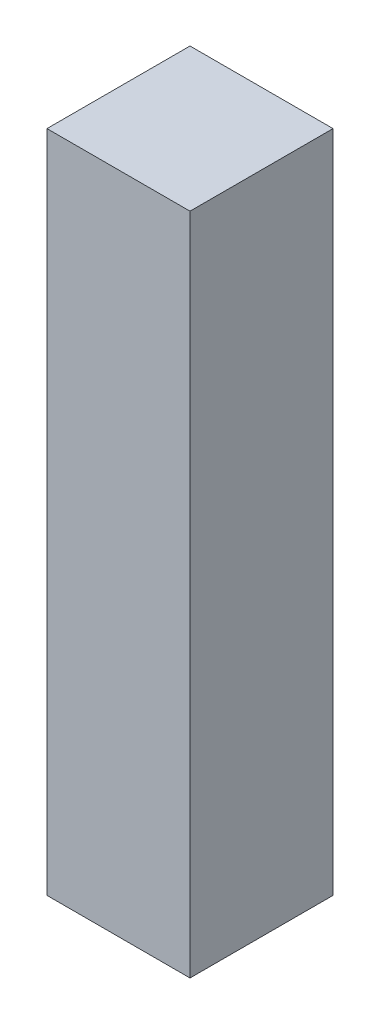
ISO-10303-21;
HEADER;
FILE_DESCRIPTION(('STEP AP214'),'2;1');
FILE_NAME('part.step','',(''),(''),'','','');
FILE_SCHEMA(('AUTOMOTIVE_DESIGN { 1 0 10303 214 1 1 1 1 }'));
ENDSEC;
DATA;
#1=APPLICATION_CONTEXT('core data for automotive mechanical design processes');
#2=APPLICATION_PROTOCOL_DEFINITION('international standard','automotive_design',2000,#1);
#3=PRODUCT_CONTEXT('',#1,'mechanical');
#4=PRODUCT('Part','Part','',(#3));
#5=PRODUCT_RELATED_PRODUCT_CATEGORY('part','',(#4));
#6=PRODUCT_DEFINITION_FORMATION('','',#4);
#7=PRODUCT_DEFINITION_CONTEXT('part definition',#1,'design');
#8=PRODUCT_DEFINITION('design','',#6,#7);
#9=PRODUCT_DEFINITION_SHAPE('','',#8);
#10=(LENGTH_UNIT() NAMED_UNIT(*) SI_UNIT(.MILLI.,.METRE.));
#11=(NAMED_UNIT(*) PLANE_ANGLE_UNIT() SI_UNIT($,.RADIAN.));
#12=(NAMED_UNIT(*) SI_UNIT($,.STERADIAN.) SOLID_ANGLE_UNIT());
#13=UNCERTAINTY_MEASURE_WITH_UNIT(LENGTH_MEASURE(1.E-05),#10,'distance_accuracy_value','');
#14=(GEOMETRIC_REPRESENTATION_CONTEXT(3) GLOBAL_UNCERTAINTY_ASSIGNED_CONTEXT((#13)) GLOBAL_UNIT_ASSIGNED_CONTEXT((#10,
#11,#12)) REPRESENTATION_CONTEXT('',''));
#15=CARTESIAN_POINT('',(0.,0.,0.));
#16=DIRECTION('',(0.,0.,1.));
#17=DIRECTION('',(1.,0.,0.));
#18=AXIS2_PLACEMENT_3D('',#15,#16,#17);
#19=CARTESIAN_POINT('',(3.5,16.25,3.5));
#20=DIRECTION('',(-1.,0.,0.));
#21=DIRECTION('',(0.,0.,1.));
#22=AXIS2_PLACEMENT_3D('',#19,#20,#21);
#23=PLANE('',#22);
#24=DIRECTION('',(0.,0.,-1.));
#25=VECTOR('',#24,1.);
#26=CARTESIAN_POINT('',(3.5,-16.25,3.5));
#27=LINE('',#26,#25);
#28=CARTESIAN_POINT('',(3.5,-16.25,3.5));
#29=VERTEX_POINT('',#28);
#30=CARTESIAN_POINT('',(3.5,-16.25,-3.5));
#31=VERTEX_POINT('',#30);
#32=EDGE_CURVE('E97',#29,#31,#27,.T.);
#33=ORIENTED_EDGE('',*,*,#32,.T.);
#34=DIRECTION('',(0.,-1.,0.));
#35=VECTOR('',#34,1.);
#36=CARTESIAN_POINT('',(3.5,16.25,-3.5));
#37=LINE('',#36,#35);
#38=CARTESIAN_POINT('',(3.5,16.25,-3.5));
#39=VERTEX_POINT('',#38);
#40=EDGE_CURVE('E11',#39,#31,#37,.T.);
#41=ORIENTED_EDGE('',*,*,#40,.F.);
#42=DIRECTION('',(0.,0.,-1.));
#43=VECTOR('',#42,1.);
#44=CARTESIAN_POINT('',(3.5,16.25,3.5));
#45=LINE('',#44,#43);
#46=CARTESIAN_POINT('',(3.5,16.25,3.5));
#47=VERTEX_POINT('',#46);
#48=EDGE_CURVE('E85',#47,#39,#45,.T.);
#49=ORIENTED_EDGE('',*,*,#48,.F.);
#50=DIRECTION('',(0.,-1.,0.));
#51=VECTOR('',#50,1.);
#52=CARTESIAN_POINT('',(3.5,16.25,3.5));
#53=LINE('',#52,#51);
#54=EDGE_CURVE('E93',#47,#29,#53,.T.);
#55=ORIENTED_EDGE('',*,*,#54,.T.);
#56=EDGE_LOOP('',(#33,#41,#49,#55));
#57=FACE_BOUND('',#56,.T.);
#58=ADVANCED_FACE('F34',(#57),#23,.F.);
#59=CARTESIAN_POINT('',(-3.5,16.25,-3.5));
#60=DIRECTION('',(0.,0.,1.));
#61=DIRECTION('',(1.,0.,0.));
#62=AXIS2_PLACEMENT_3D('',#59,#60,#61);
#63=PLANE('',#62);
#64=DIRECTION('',(-1.,0.,0.));
#65=VECTOR('',#64,1.);
#66=CARTESIAN_POINT('',(-3.5,-16.25,-3.5));
#67=LINE('',#66,#65);
#68=CARTESIAN_POINT('',(-3.5,-16.25,-3.5));
#69=VERTEX_POINT('',#68);
#70=EDGE_CURVE('E89',#31,#69,#67,.T.);
#71=ORIENTED_EDGE('',*,*,#70,.T.);
#72=DIRECTION('',(0.,-1.,0.));
#73=VECTOR('',#72,1.);
#74=CARTESIAN_POINT('',(-3.5,16.25,-3.5));
#75=LINE('',#74,#73);
#76=CARTESIAN_POINT('',(-3.5,16.25,-3.5));
#77=VERTEX_POINT('',#76);
#78=EDGE_CURVE('E42',#77,#69,#75,.T.);
#79=ORIENTED_EDGE('',*,*,#78,.F.);
#80=DIRECTION('',(-1.,0.,0.));
#81=VECTOR('',#80,1.);
#82=CARTESIAN_POINT('',(-3.5,16.25,-3.5));
#83=LINE('',#82,#81);
#84=EDGE_CURVE('E80',#39,#77,#83,.T.);
#85=ORIENTED_EDGE('',*,*,#84,.F.);
#86=ORIENTED_EDGE('',*,*,#40,.T.);
#87=EDGE_LOOP('',(#71,#79,#85,#86));
#88=FACE_BOUND('',#87,.T.);
#89=ADVANCED_FACE('F88',(#88),#63,.F.);
#90=CARTESIAN_POINT('',(-3.5,16.25,3.5));
#91=DIRECTION('',(1.,0.,0.));
#92=DIRECTION('',(0.,0.,-1.));
#93=AXIS2_PLACEMENT_3D('',#90,#91,#92);
#94=PLANE('',#93);
#95=DIRECTION('',(0.,0.,1.));
#96=VECTOR('',#95,1.);
#97=CARTESIAN_POINT('',(-3.5,-16.25,3.5));
#98=LINE('',#97,#96);
#99=CARTESIAN_POINT('',(-3.5,-16.25,3.5));
#100=VERTEX_POINT('',#99);
#101=EDGE_CURVE('E67',#69,#100,#98,.T.);
#102=ORIENTED_EDGE('',*,*,#101,.T.);
#103=DIRECTION('',(0.,-1.,0.));
#104=VECTOR('',#103,1.);
#105=CARTESIAN_POINT('',(-3.5,16.25,3.5));
#106=LINE('',#105,#104);
#107=CARTESIAN_POINT('',(-3.5,16.25,3.5));
#108=VERTEX_POINT('',#107);
#109=EDGE_CURVE('E90',#108,#100,#106,.T.);
#110=ORIENTED_EDGE('',*,*,#109,.F.);
#111=DIRECTION('',(0.,0.,1.));
#112=VECTOR('',#111,1.);
#113=CARTESIAN_POINT('',(-3.5,16.25,3.5));
#114=LINE('',#113,#112);
#115=EDGE_CURVE('E83',#77,#108,#114,.T.);
#116=ORIENTED_EDGE('',*,*,#115,.F.);
#117=ORIENTED_EDGE('',*,*,#78,.T.);
#118=EDGE_LOOP('',(#102,#110,#116,#117));
#119=FACE_BOUND('',#118,.T.);
#120=ADVANCED_FACE('F91',(#119),#94,.F.);
#121=CARTESIAN_POINT('',(-3.5,16.25,3.5));
#122=DIRECTION('',(0.,0.,-1.));
#123=DIRECTION('',(-1.,0.,0.));
#124=AXIS2_PLACEMENT_3D('',#121,#122,#123);
#125=PLANE('',#124);
#126=DIRECTION('',(1.,0.,0.));
#127=VECTOR('',#126,1.);
#128=CARTESIAN_POINT('',(-3.5,-16.25,3.5));
#129=LINE('',#128,#127);
#130=EDGE_CURVE('E73',#100,#29,#129,.T.);
#131=ORIENTED_EDGE('',*,*,#130,.T.);
#132=ORIENTED_EDGE('',*,*,#54,.F.);
#133=DIRECTION('',(1.,0.,0.));
#134=VECTOR('',#133,1.);
#135=CARTESIAN_POINT('',(-3.5,16.25,3.5));
#136=LINE('',#135,#134);
#137=EDGE_CURVE('E50',#108,#47,#136,.T.);
#138=ORIENTED_EDGE('',*,*,#137,.F.);
#139=ORIENTED_EDGE('',*,*,#109,.T.);
#140=EDGE_LOOP('',(#131,#132,#138,#139));
#141=FACE_BOUND('',#140,.T.);
#142=ADVANCED_FACE('F104',(#141),#125,.F.);
#143=CARTESIAN_POINT('',(0.,16.25,0.));
#144=DIRECTION('',(0.,-1.,0.));
#145=DIRECTION('',(0.,0.,-1.));
#146=AXIS2_PLACEMENT_3D('',#143,#144,#145);
#147=PLANE('',#146);
#148=ORIENTED_EDGE('',*,*,#48,.T.);
#149=ORIENTED_EDGE('',*,*,#84,.T.);
#150=ORIENTED_EDGE('',*,*,#115,.T.);
#151=ORIENTED_EDGE('',*,*,#137,.T.);
#152=EDGE_LOOP('',(#148,#149,#150,#151));
#153=FACE_BOUND('',#152,.T.);
#154=ADVANCED_FACE('F81',(#153),#147,.F.);
#155=CARTESIAN_POINT('',(0.,-16.25,0.));
#156=DIRECTION('',(0.,-1.,0.));
#157=DIRECTION('',(0.,0.,-1.));
#158=AXIS2_PLACEMENT_3D('',#155,#156,#157);
#159=PLANE('',#158);
#160=ORIENTED_EDGE('',*,*,#32,.F.);
#161=ORIENTED_EDGE('',*,*,#130,.F.);
#162=ORIENTED_EDGE('',*,*,#101,.F.);
#163=ORIENTED_EDGE('',*,*,#70,.F.);
#164=EDGE_LOOP('',(#160,#161,#162,#163));
#165=FACE_BOUND('',#164,.T.);
#166=ADVANCED_FACE('F107',(#165),#159,.T.);
#167=CLOSED_SHELL('',(#58,#89,#120,#142,#154,#166));
#168=MANIFOLD_SOLID_BREP('B2',#167);
#169=ADVANCED_BREP_SHAPE_REPRESENTATION('',(#18,#168),#14);
#170=SHAPE_DEFINITION_REPRESENTATION(#9,#169);
ENDSEC;
END-ISO-10303-21;
